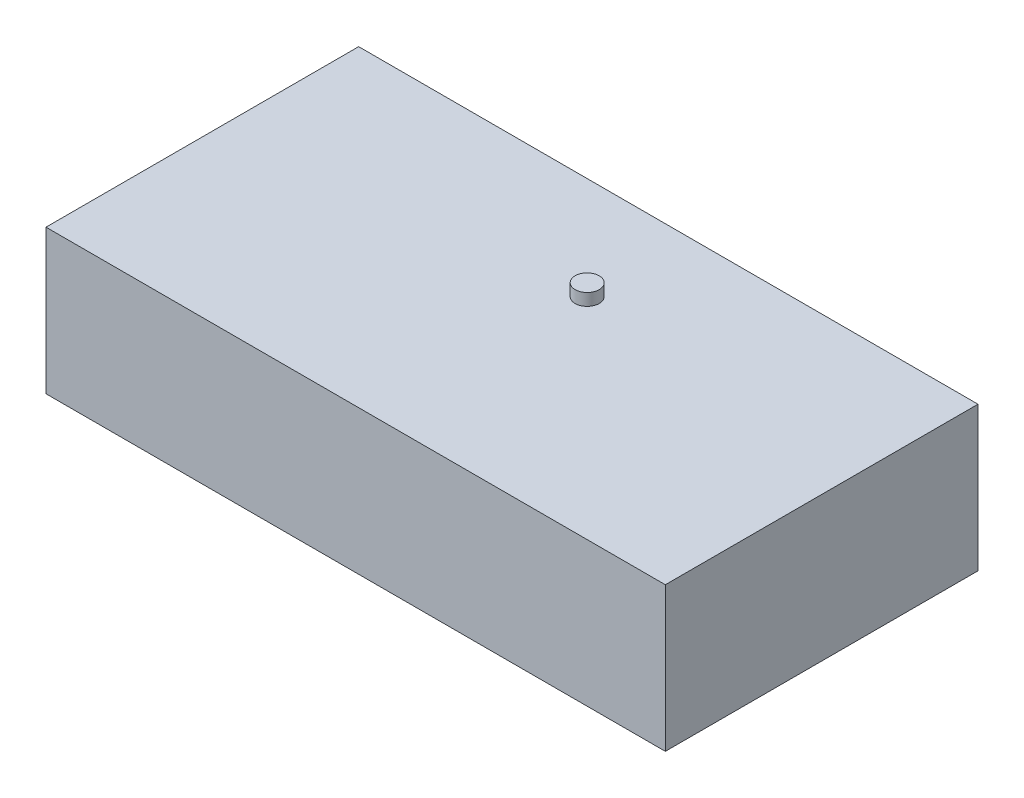
ISO-10303-21;
HEADER;
FILE_DESCRIPTION(('STEP AP214'),'2;1');
FILE_NAME('part.step','',(''),(''),'','','');
FILE_SCHEMA(('AUTOMOTIVE_DESIGN { 1 0 10303 214 1 1 1 1 }'));
ENDSEC;
DATA;
#1=APPLICATION_CONTEXT('core data for automotive mechanical design processes');
#2=APPLICATION_PROTOCOL_DEFINITION('international standard','automotive_design',2000,#1);
#3=PRODUCT_CONTEXT('',#1,'mechanical');
#4=PRODUCT('Part','Part','',(#3));
#5=PRODUCT_RELATED_PRODUCT_CATEGORY('part','',(#4));
#6=PRODUCT_DEFINITION_FORMATION('','',#4);
#7=PRODUCT_DEFINITION_CONTEXT('part definition',#1,'design');
#8=PRODUCT_DEFINITION('design','',#6,#7);
#9=PRODUCT_DEFINITION_SHAPE('','',#8);
#10=(LENGTH_UNIT() NAMED_UNIT(*) SI_UNIT(.MILLI.,.METRE.));
#11=(NAMED_UNIT(*) PLANE_ANGLE_UNIT() SI_UNIT($,.RADIAN.));
#12=(NAMED_UNIT(*) SI_UNIT($,.STERADIAN.) SOLID_ANGLE_UNIT());
#13=UNCERTAINTY_MEASURE_WITH_UNIT(LENGTH_MEASURE(1.E-05),#10,'distance_accuracy_value','');
#14=(GEOMETRIC_REPRESENTATION_CONTEXT(3) GLOBAL_UNCERTAINTY_ASSIGNED_CONTEXT((#13)) GLOBAL_UNIT_ASSIGNED_CONTEXT((#10,
#11,#12)) REPRESENTATION_CONTEXT('',''));
#15=CARTESIAN_POINT('',(0.,0.,0.));
#16=DIRECTION('',(0.,0.,1.));
#17=DIRECTION('',(1.,0.,0.));
#18=AXIS2_PLACEMENT_3D('',#15,#16,#17);
#19=CARTESIAN_POINT('',(0.,12.,0.));
#20=DIRECTION('',(1.,0.,0.));
#21=DIRECTION('',(0.,0.,-1.));
#22=AXIS2_PLACEMENT_3D('',#19,#20,#21);
#23=PLANE('',#22);
#24=DIRECTION('',(0.,0.,1.));
#25=VECTOR('',#24,1.);
#26=CARTESIAN_POINT('',(0.,0.,0.));
#27=LINE('',#26,#25);
#28=CARTESIAN_POINT('',(0.,0.,-26.));
#29=VERTEX_POINT('',#28);
#30=CARTESIAN_POINT('',(0.,0.,0.));
#31=VERTEX_POINT('',#30);
#32=EDGE_CURVE('E99',#29,#31,#27,.T.);
#33=ORIENTED_EDGE('',*,*,#32,.T.);
#34=DIRECTION('',(0.,-1.,0.));
#35=VECTOR('',#34,1.);
#36=CARTESIAN_POINT('',(0.,12.,0.));
#37=LINE('',#36,#35);
#38=CARTESIAN_POINT('',(0.,12.,0.));
#39=VERTEX_POINT('',#38);
#40=EDGE_CURVE('E41',#39,#31,#37,.T.);
#41=ORIENTED_EDGE('',*,*,#40,.F.);
#42=DIRECTION('',(0.,0.,1.));
#43=VECTOR('',#42,1.);
#44=CARTESIAN_POINT('',(0.,12.,0.));
#45=LINE('',#44,#43);
#46=CARTESIAN_POINT('',(0.,12.,-26.));
#47=VERTEX_POINT('',#46);
#48=EDGE_CURVE('E85',#47,#39,#45,.T.);
#49=ORIENTED_EDGE('',*,*,#48,.F.);
#50=DIRECTION('',(0.,-1.,0.));
#51=VECTOR('',#50,1.);
#52=CARTESIAN_POINT('',(0.,12.,-26.));
#53=LINE('',#52,#51);
#54=EDGE_CURVE('E95',#47,#29,#53,.T.);
#55=ORIENTED_EDGE('',*,*,#54,.T.);
#56=EDGE_LOOP('',(#33,#41,#49,#55));
#57=FACE_BOUND('',#56,.T.);
#58=ADVANCED_FACE('F33',(#57),#23,.F.);
#59=CARTESIAN_POINT('',(0.,12.,0.));
#60=DIRECTION('',(0.,0.,-1.));
#61=DIRECTION('',(-1.,0.,0.));
#62=AXIS2_PLACEMENT_3D('',#59,#60,#61);
#63=PLANE('',#62);
#64=DIRECTION('',(1.,0.,0.));
#65=VECTOR('',#64,1.);
#66=CARTESIAN_POINT('',(0.,0.,0.));
#67=LINE('',#66,#65);
#68=CARTESIAN_POINT('',(51.5,0.,0.));
#69=VERTEX_POINT('',#68);
#70=EDGE_CURVE('E90',#31,#69,#67,.T.);
#71=ORIENTED_EDGE('',*,*,#70,.T.);
#72=DIRECTION('',(0.,-1.,0.));
#73=VECTOR('',#72,1.);
#74=CARTESIAN_POINT('',(51.5,12.,0.));
#75=LINE('',#74,#73);
#76=CARTESIAN_POINT('',(51.5,12.,0.));
#77=VERTEX_POINT('',#76);
#78=EDGE_CURVE('E88',#77,#69,#75,.T.);
#79=ORIENTED_EDGE('',*,*,#78,.F.);
#80=DIRECTION('',(1.,0.,0.));
#81=VECTOR('',#80,1.);
#82=CARTESIAN_POINT('',(0.,12.,0.));
#83=LINE('',#82,#81);
#84=EDGE_CURVE('E80',#39,#77,#83,.T.);
#85=ORIENTED_EDGE('',*,*,#84,.F.);
#86=ORIENTED_EDGE('',*,*,#40,.T.);
#87=EDGE_LOOP('',(#71,#79,#85,#86));
#88=FACE_BOUND('',#87,.T.);
#89=ADVANCED_FACE('F89',(#88),#63,.F.);
#90=CARTESIAN_POINT('',(51.5,12.,0.));
#91=DIRECTION('',(-1.,0.,0.));
#92=DIRECTION('',(0.,0.,1.));
#93=AXIS2_PLACEMENT_3D('',#90,#91,#92);
#94=PLANE('',#93);
#95=DIRECTION('',(0.,0.,-1.));
#96=VECTOR('',#95,1.);
#97=CARTESIAN_POINT('',(51.5,0.,0.));
#98=LINE('',#97,#96);
#99=CARTESIAN_POINT('',(51.5,0.,-26.));
#100=VERTEX_POINT('',#99);
#101=EDGE_CURVE('E66',#69,#100,#98,.T.);
#102=ORIENTED_EDGE('',*,*,#101,.T.);
#103=DIRECTION('',(0.,-1.,0.));
#104=VECTOR('',#103,1.);
#105=CARTESIAN_POINT('',(51.5,12.,-26.));
#106=LINE('',#105,#104);
#107=CARTESIAN_POINT('',(51.5,12.,-26.));
#108=VERTEX_POINT('',#107);
#109=EDGE_CURVE('E91',#108,#100,#106,.T.);
#110=ORIENTED_EDGE('',*,*,#109,.F.);
#111=DIRECTION('',(0.,0.,-1.));
#112=VECTOR('',#111,1.);
#113=CARTESIAN_POINT('',(51.5,12.,0.));
#114=LINE('',#113,#112);
#115=EDGE_CURVE('E83',#77,#108,#114,.T.);
#116=ORIENTED_EDGE('',*,*,#115,.F.);
#117=ORIENTED_EDGE('',*,*,#78,.T.);
#118=EDGE_LOOP('',(#102,#110,#116,#117));
#119=FACE_BOUND('',#118,.T.);
#120=ADVANCED_FACE('F93',(#119),#94,.F.);
#121=CARTESIAN_POINT('',(0.,12.,-26.));
#122=DIRECTION('',(0.,0.,1.));
#123=DIRECTION('',(1.,0.,0.));
#124=AXIS2_PLACEMENT_3D('',#121,#122,#123);
#125=PLANE('',#124);
#126=DIRECTION('',(-1.,0.,0.));
#127=VECTOR('',#126,1.);
#128=CARTESIAN_POINT('',(0.,0.,-26.));
#129=LINE('',#128,#127);
#130=EDGE_CURVE('E72',#100,#29,#129,.T.);
#131=ORIENTED_EDGE('',*,*,#130,.T.);
#132=ORIENTED_EDGE('',*,*,#54,.F.);
#133=DIRECTION('',(-1.,0.,0.));
#134=VECTOR('',#133,1.);
#135=CARTESIAN_POINT('',(0.,12.,-26.));
#136=LINE('',#135,#134);
#137=EDGE_CURVE('E49',#108,#47,#136,.T.);
#138=ORIENTED_EDGE('',*,*,#137,.F.);
#139=ORIENTED_EDGE('',*,*,#109,.T.);
#140=EDGE_LOOP('',(#131,#132,#138,#139));
#141=FACE_BOUND('',#140,.T.);
#142=ADVANCED_FACE('F121',(#141),#125,.F.);
#143=CARTESIAN_POINT('',(0.,12.,0.));
#144=DIRECTION('',(0.,-1.,0.));
#145=DIRECTION('',(0.,0.,-1.));
#146=AXIS2_PLACEMENT_3D('',#143,#144,#145);
#147=PLANE('',#146);
#148=CARTESIAN_POINT('',(27.5,12.,-17.5));
#149=DIRECTION('',(0.,-1.,0.));
#150=DIRECTION('',(0.,0.,-1.));
#151=AXIS2_PLACEMENT_3D('',#148,#149,#150);
#152=CIRCLE('',#151,1.);
#153=CARTESIAN_POINT('',(27.5,12.,-18.5));
#154=VERTEX_POINT('',#153);
#155=EDGE_CURVE('E11',#154,#154,#152,.F.);
#156=ORIENTED_EDGE('',*,*,#155,.F.);
#157=EDGE_LOOP('',(#156));
#158=FACE_BOUND('',#157,.T.);
#159=ORIENTED_EDGE('',*,*,#48,.T.);
#160=ORIENTED_EDGE('',*,*,#84,.T.);
#161=ORIENTED_EDGE('',*,*,#115,.T.);
#162=ORIENTED_EDGE('',*,*,#137,.T.);
#163=EDGE_LOOP('',(#159,#160,#161,#162));
#164=FACE_BOUND('',#163,.T.);
#165=ADVANCED_FACE('F81',(#158,#164),#147,.F.);
#166=CARTESIAN_POINT('',(0.,0.,0.));
#167=DIRECTION('',(0.,-1.,0.));
#168=DIRECTION('',(0.,0.,-1.));
#169=AXIS2_PLACEMENT_3D('',#166,#167,#168);
#170=PLANE('',#169);
#171=ORIENTED_EDGE('',*,*,#32,.F.);
#172=ORIENTED_EDGE('',*,*,#130,.F.);
#173=ORIENTED_EDGE('',*,*,#101,.F.);
#174=ORIENTED_EDGE('',*,*,#70,.F.);
#175=EDGE_LOOP('',(#171,#172,#173,#174));
#176=FACE_BOUND('',#175,.T.);
#177=ADVANCED_FACE('F110',(#176),#170,.T.);
#178=CARTESIAN_POINT('',(27.5,13.,-17.5));
#179=DIRECTION('',(0.,-1.,0.));
#180=DIRECTION('',(0.,0.,-1.));
#181=AXIS2_PLACEMENT_3D('',#178,#179,#180);
#182=CYLINDRICAL_SURFACE('',#181,1.);
#183=CARTESIAN_POINT('',(27.5,13.,-17.5));
#184=DIRECTION('',(0.,1.,0.));
#185=DIRECTION('',(0.,0.,1.));
#186=AXIS2_PLACEMENT_3D('',#183,#184,#185);
#187=CIRCLE('',#186,1.);
#188=CARTESIAN_POINT('',(27.5,13.,-16.5));
#189=VERTEX_POINT('',#188);
#190=EDGE_CURVE('E102',#189,#189,#187,.T.);
#191=ORIENTED_EDGE('',*,*,#190,.F.);
#192=EDGE_LOOP('',(#191));
#193=FACE_BOUND('',#192,.T.);
#194=ORIENTED_EDGE('',*,*,#155,.T.);
#195=EDGE_LOOP('',(#194));
#196=FACE_BOUND('',#195,.T.);
#197=ADVANCED_FACE('F112',(#193,#196),#182,.T.);
#198=CARTESIAN_POINT('',(27.5,13.,-17.5));
#199=DIRECTION('',(0.,1.,0.));
#200=DIRECTION('',(0.,0.,1.));
#201=AXIS2_PLACEMENT_3D('',#198,#199,#200);
#202=PLANE('',#201);
#203=ORIENTED_EDGE('',*,*,#190,.T.);
#204=EDGE_LOOP('',(#203));
#205=FACE_BOUND('',#204,.T.);
#206=ADVANCED_FACE('F118',(#205),#202,.T.);
#207=CLOSED_SHELL('',(#58,#89,#120,#142,#165,#177,#197,#206));
#208=MANIFOLD_SOLID_BREP('B2',#207);
#209=ADVANCED_BREP_SHAPE_REPRESENTATION('',(#18,#208),#14);
#210=SHAPE_DEFINITION_REPRESENTATION(#9,#209);
ENDSEC;
END-ISO-10303-21;
